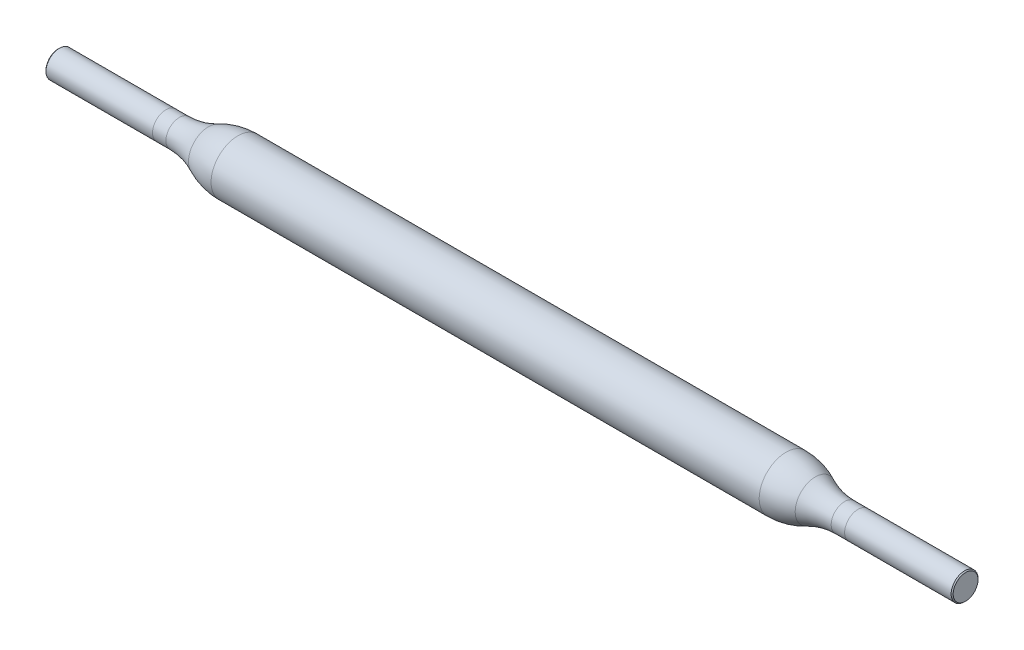
ISO-10303-21;
HEADER;
FILE_DESCRIPTION(('STEP AP214'),'2;1');
FILE_NAME('part.step','',(''),(''),'','','');
FILE_SCHEMA(('AUTOMOTIVE_DESIGN { 1 0 10303 214 1 1 1 1 }'));
ENDSEC;
DATA;
#1=APPLICATION_CONTEXT('core data for automotive mechanical design processes');
#2=APPLICATION_PROTOCOL_DEFINITION('international standard','automotive_design',2000,#1);
#3=PRODUCT_CONTEXT('',#1,'mechanical');
#4=PRODUCT('Part','Part','',(#3));
#5=PRODUCT_RELATED_PRODUCT_CATEGORY('part','',(#4));
#6=PRODUCT_DEFINITION_FORMATION('','',#4);
#7=PRODUCT_DEFINITION_CONTEXT('part definition',#1,'design');
#8=PRODUCT_DEFINITION('design','',#6,#7);
#9=PRODUCT_DEFINITION_SHAPE('','',#8);
#10=(LENGTH_UNIT() NAMED_UNIT(*) SI_UNIT(.MILLI.,.METRE.));
#11=(NAMED_UNIT(*) PLANE_ANGLE_UNIT() SI_UNIT($,.RADIAN.));
#12=(NAMED_UNIT(*) SI_UNIT($,.STERADIAN.) SOLID_ANGLE_UNIT());
#13=UNCERTAINTY_MEASURE_WITH_UNIT(LENGTH_MEASURE(1.E-05),#10,'distance_accuracy_value','');
#14=(GEOMETRIC_REPRESENTATION_CONTEXT(3) GLOBAL_UNCERTAINTY_ASSIGNED_CONTEXT((#13)) GLOBAL_UNIT_ASSIGNED_CONTEXT((#10,
#11,#12)) REPRESENTATION_CONTEXT('',''));
#15=CARTESIAN_POINT('',(0.,0.,0.));
#16=DIRECTION('',(0.,0.,1.));
#17=DIRECTION('',(1.,0.,0.));
#18=AXIS2_PLACEMENT_3D('',#15,#16,#17);
#19=CARTESIAN_POINT('',(-33.75,0.,0.));
#20=DIRECTION('',(-1.,0.,0.));
#21=DIRECTION('',(0.,0.,1.));
#22=AXIS2_PLACEMENT_3D('',#19,#20,#21);
#23=CYLINDRICAL_SURFACE('',#22,1.);
#24=CARTESIAN_POINT('',(24.75,0.,0.));
#25=DIRECTION('',(-1.,0.,0.));
#26=DIRECTION('',(0.,0.,1.));
#27=AXIS2_PLACEMENT_3D('',#24,#25,#26);
#28=CIRCLE('',#27,1.);
#29=CARTESIAN_POINT('',(24.75,0.,1.));
#30=VERTEX_POINT('',#29);
#31=EDGE_CURVE('E80',#30,#30,#28,.T.);
#32=ORIENTED_EDGE('',*,*,#31,.F.);
#33=EDGE_LOOP('',(#32));
#34=FACE_BOUND('',#33,.T.);
#35=CARTESIAN_POINT('',(25.75,0.,0.));
#36=DIRECTION('',(1.,0.,0.));
#37=DIRECTION('',(0.,0.,-1.));
#38=AXIS2_PLACEMENT_3D('',#35,#36,#37);
#39=CIRCLE('',#38,1.);
#40=CARTESIAN_POINT('',(25.75,0.,-1.));
#41=VERTEX_POINT('',#40);
#42=EDGE_CURVE('E72',#41,#41,#39,.T.);
#43=ORIENTED_EDGE('',*,*,#42,.F.);
#44=EDGE_LOOP('',(#43));
#45=FACE_BOUND('',#44,.T.);
#46=ADVANCED_FACE('F47',(#34,#45),#23,.T.);
#47=CARTESIAN_POINT('',(-33.75,0.,0.));
#48=DIRECTION('',(-1.,0.,0.));
#49=DIRECTION('',(0.,0.,1.));
#50=AXIS2_PLACEMENT_3D('',#47,#48,#49);
#51=CYLINDRICAL_SURFACE('',#50,1.);
#52=CARTESIAN_POINT('',(-33.675,0.,0.));
#53=DIRECTION('',(1.,0.,0.));
#54=DIRECTION('',(0.,0.,-1.));
#55=AXIS2_PLACEMENT_3D('',#52,#53,#54);
#56=CIRCLE('',#55,1.);
#57=CARTESIAN_POINT('',(-33.675,0.,-0.999999999999997));
#58=VERTEX_POINT('',#57);
#59=EDGE_CURVE('E10',#58,#58,#56,.T.);
#60=ORIENTED_EDGE('',*,*,#59,.T.);
#61=EDGE_LOOP('',(#60));
#62=FACE_BOUND('',#61,.T.);
#63=CARTESIAN_POINT('',(-25.75,0.,0.));
#64=DIRECTION('',(1.,0.,0.));
#65=DIRECTION('',(0.,0.,-1.));
#66=AXIS2_PLACEMENT_3D('',#63,#64,#65);
#67=CIRCLE('',#66,1.);
#68=CARTESIAN_POINT('',(-25.75,0.,-1.));
#69=VERTEX_POINT('',#68);
#70=EDGE_CURVE('E76',#69,#69,#67,.T.);
#71=ORIENTED_EDGE('',*,*,#70,.F.);
#72=EDGE_LOOP('',(#71));
#73=FACE_BOUND('',#72,.T.);
#74=ADVANCED_FACE('F140',(#62,#73),#51,.T.);
#75=CARTESIAN_POINT('',(-33.75,0.,0.));
#76=DIRECTION('',(1.,0.,0.));
#77=DIRECTION('',(0.,0.,-1.));
#78=AXIS2_PLACEMENT_3D('',#75,#76,#77);
#79=PLANE('',#78);
#80=CARTESIAN_POINT('',(-33.75,0.,0.));
#81=DIRECTION('',(1.,0.,0.));
#82=DIRECTION('',(0.,0.,-1.));
#83=AXIS2_PLACEMENT_3D('',#80,#81,#82);
#84=CIRCLE('',#83,0.925000000000023);
#85=CARTESIAN_POINT('',(-33.75,0.,-0.92500000000002));
#86=VERTEX_POINT('',#85);
#87=EDGE_CURVE('E56',#86,#86,#84,.F.);
#88=ORIENTED_EDGE('',*,*,#87,.T.);
#89=EDGE_LOOP('',(#88));
#90=FACE_BOUND('',#89,.T.);
#91=ADVANCED_FACE('F150',(#90),#79,.F.);
#92=CARTESIAN_POINT('',(33.75,0.,0.));
#93=DIRECTION('',(-1.,0.,0.));
#94=DIRECTION('',(0.,0.,1.));
#95=AXIS2_PLACEMENT_3D('',#92,#93,#94);
#96=PLANE('',#95);
#97=CARTESIAN_POINT('',(33.75,0.,0.));
#98=DIRECTION('',(-1.,0.,0.));
#99=DIRECTION('',(0.,0.,1.));
#100=AXIS2_PLACEMENT_3D('',#97,#98,#99);
#101=CIRCLE('',#100,0.925000000000009);
#102=CARTESIAN_POINT('',(33.75,0.,0.925000000000009));
#103=VERTEX_POINT('',#102);
#104=EDGE_CURVE('E61',#103,#103,#101,.F.);
#105=ORIENTED_EDGE('',*,*,#104,.T.);
#106=EDGE_LOOP('',(#105));
#107=FACE_BOUND('',#106,.T.);
#108=ADVANCED_FACE('F145',(#107),#96,.F.);
#109=CARTESIAN_POINT('',(33.675,0.,0.));
#110=DIRECTION('',(-1.,0.,0.));
#111=DIRECTION('',(0.,0.,1.));
#112=AXIS2_PLACEMENT_3D('',#109,#110,#111);
#113=CIRCLE('',#112,1.);
#114=CARTESIAN_POINT('',(33.675,0.,1.));
#115=VERTEX_POINT('',#114);
#116=EDGE_CURVE('E66',#115,#115,#113,.T.);
#117=ORIENTED_EDGE('',*,*,#116,.T.);
#118=EDGE_LOOP('',(#117));
#119=FACE_BOUND('',#118,.T.);
#120=ORIENTED_EDGE('',*,*,#42,.T.);
#121=EDGE_LOOP('',(#120));
#122=FACE_BOUND('',#121,.T.);
#123=ADVANCED_FACE('F134',(#119,#122),#23,.T.);
#124=CARTESIAN_POINT('',(24.75,0.,0.));
#125=DIRECTION('',(-1.,0.,0.));
#126=DIRECTION('',(0.,0.,1.));
#127=AXIS2_PLACEMENT_3D('',#124,#125,#126);
#128=TOROIDAL_SURFACE('',#127,6.,5.);
#129=CARTESIAN_POINT('',(22.5705505282297,0.,0.));
#130=DIRECTION('',(-1.,0.,0.));
#131=DIRECTION('',(0.,0.,1.));
#132=AXIS2_PLACEMENT_3D('',#129,#130,#131);
#133=CIRCLE('',#132,1.5);
#134=CARTESIAN_POINT('',(22.5705505282297,0.,1.5));
#135=VERTEX_POINT('',#134);
#136=EDGE_CURVE('E84',#135,#135,#133,.T.);
#137=ORIENTED_EDGE('',*,*,#136,.F.);
#138=EDGE_LOOP('',(#137));
#139=FACE_BOUND('',#138,.T.);
#140=ORIENTED_EDGE('',*,*,#31,.T.);
#141=EDGE_LOOP('',(#140));
#142=FACE_BOUND('',#141,.T.);
#143=ADVANCED_FACE('F128',(#139,#142),#128,.F.);
#144=CARTESIAN_POINT('',(20.3911010564593,0.,0.));
#145=DIRECTION('',(-1.,0.,0.));
#146=DIRECTION('',(0.,0.,1.));
#147=AXIS2_PLACEMENT_3D('',#144,#145,#146);
#148=DEGENERATE_TOROIDAL_SURFACE('',#147,3.,5.,.F.);
#149=CARTESIAN_POINT('',(20.3911010564593,0.,0.));
#150=DIRECTION('',(-1.,0.,0.));
#151=DIRECTION('',(0.,0.,1.));
#152=AXIS2_PLACEMENT_3D('',#149,#150,#151);
#153=CIRCLE('',#152,2.);
#154=CARTESIAN_POINT('',(20.3911010564593,0.,2.));
#155=VERTEX_POINT('',#154);
#156=EDGE_CURVE('E88',#155,#155,#153,.T.);
#157=ORIENTED_EDGE('',*,*,#156,.F.);
#158=EDGE_LOOP('',(#157));
#159=FACE_BOUND('',#158,.T.);
#160=ORIENTED_EDGE('',*,*,#136,.T.);
#161=EDGE_LOOP('',(#160));
#162=FACE_BOUND('',#161,.T.);
#163=ADVANCED_FACE('F122',(#159,#162),#148,.F.);
#164=CARTESIAN_POINT('',(-33.75,0.,0.));
#165=DIRECTION('',(-1.,0.,0.));
#166=DIRECTION('',(0.,0.,1.));
#167=AXIS2_PLACEMENT_3D('',#164,#165,#166);
#168=CYLINDRICAL_SURFACE('',#167,2.);
#169=CARTESIAN_POINT('',(-20.3911010564593,0.,0.));
#170=DIRECTION('',(-1.,0.,0.));
#171=DIRECTION('',(0.,0.,1.));
#172=AXIS2_PLACEMENT_3D('',#169,#170,#171);
#173=CIRCLE('',#172,2.);
#174=CARTESIAN_POINT('',(-20.3911010564593,0.,2.));
#175=VERTEX_POINT('',#174);
#176=EDGE_CURVE('E92',#175,#175,#173,.T.);
#177=ORIENTED_EDGE('',*,*,#176,.F.);
#178=EDGE_LOOP('',(#177));
#179=FACE_BOUND('',#178,.T.);
#180=ORIENTED_EDGE('',*,*,#156,.T.);
#181=EDGE_LOOP('',(#180));
#182=FACE_BOUND('',#181,.T.);
#183=ADVANCED_FACE('F116',(#179,#182),#168,.T.);
#184=CARTESIAN_POINT('',(-20.3911010564593,0.,0.));
#185=DIRECTION('',(-1.,0.,0.));
#186=DIRECTION('',(0.,0.,1.));
#187=AXIS2_PLACEMENT_3D('',#184,#185,#186);
#188=DEGENERATE_TOROIDAL_SURFACE('',#187,3.,5.,.F.);
#189=CARTESIAN_POINT('',(-22.5705505282297,0.,0.));
#190=DIRECTION('',(-1.,0.,0.));
#191=DIRECTION('',(0.,0.,1.));
#192=AXIS2_PLACEMENT_3D('',#189,#190,#191);
#193=CIRCLE('',#192,1.5);
#194=CARTESIAN_POINT('',(-22.5705505282297,0.,1.5));
#195=VERTEX_POINT('',#194);
#196=EDGE_CURVE('E96',#195,#195,#193,.T.);
#197=ORIENTED_EDGE('',*,*,#196,.F.);
#198=EDGE_LOOP('',(#197));
#199=FACE_BOUND('',#198,.T.);
#200=ORIENTED_EDGE('',*,*,#176,.T.);
#201=EDGE_LOOP('',(#200));
#202=FACE_BOUND('',#201,.T.);
#203=ADVANCED_FACE('F110',(#199,#202),#188,.F.);
#204=CARTESIAN_POINT('',(-24.75,0.,0.));
#205=DIRECTION('',(-1.,0.,0.));
#206=DIRECTION('',(0.,0.,1.));
#207=AXIS2_PLACEMENT_3D('',#204,#205,#206);
#208=TOROIDAL_SURFACE('',#207,6.,5.);
#209=CARTESIAN_POINT('',(-24.75,0.,0.));
#210=DIRECTION('',(-1.,0.,0.));
#211=DIRECTION('',(0.,0.,1.));
#212=AXIS2_PLACEMENT_3D('',#209,#210,#211);
#213=CIRCLE('',#212,1.);
#214=CARTESIAN_POINT('',(-24.75,0.,1.));
#215=VERTEX_POINT('',#214);
#216=EDGE_CURVE('E100',#215,#215,#213,.T.);
#217=ORIENTED_EDGE('',*,*,#216,.F.);
#218=EDGE_LOOP('',(#217));
#219=FACE_BOUND('',#218,.T.);
#220=ORIENTED_EDGE('',*,*,#196,.T.);
#221=EDGE_LOOP('',(#220));
#222=FACE_BOUND('',#221,.T.);
#223=ADVANCED_FACE('F107',(#219,#222),#208,.F.);
#224=ORIENTED_EDGE('',*,*,#70,.T.);
#225=EDGE_LOOP('',(#224));
#226=FACE_BOUND('',#225,.T.);
#227=ORIENTED_EDGE('',*,*,#216,.T.);
#228=EDGE_LOOP('',(#227));
#229=FACE_BOUND('',#228,.T.);
#230=ADVANCED_FACE('F105',(#226,#229),#51,.T.);
#231=CARTESIAN_POINT('',(33.675,0.,0.));
#232=DIRECTION('',(-1.,0.,0.));
#233=DIRECTION('',(0.,0.,1.));
#234=AXIS2_PLACEMENT_3D('',#231,#232,#233);
#235=CONICAL_SURFACE('',#234,1.,0.785398163397445);
#236=ORIENTED_EDGE('',*,*,#104,.F.);
#237=EDGE_LOOP('',(#236));
#238=FACE_BOUND('',#237,.T.);
#239=ORIENTED_EDGE('',*,*,#116,.F.);
#240=EDGE_LOOP('',(#239));
#241=FACE_BOUND('',#240,.T.);
#242=ADVANCED_FACE('F156',(#238,#241),#235,.T.);
#243=CARTESIAN_POINT('',(-33.75,0.,0.));
#244=DIRECTION('',(1.,0.,0.));
#245=DIRECTION('',(0.,0.,-1.));
#246=AXIS2_PLACEMENT_3D('',#243,#244,#245);
#247=CONICAL_SURFACE('',#246,0.925000000000023,0.785398163397495);
#248=CARTESIAN_POINT('',(-33.675,0.,-0.999999999999997));
#249=CARTESIAN_POINT('',(-33.67578125,0.,-0.999218749999997));
#250=CARTESIAN_POINT('',(-33.6765625,0.,-0.998437499999998));
#251=CARTESIAN_POINT('',(-33.678125,0.,-0.996874999999999));
#252=CARTESIAN_POINT('',(-33.67890625,0.,-0.996093749999999));
#253=CARTESIAN_POINT('',(-33.68046875,0.,-0.994531249999999));
#254=CARTESIAN_POINT('',(-33.68125,0.,-0.993749999999999));
#255=CARTESIAN_POINT('',(-33.6828125,0.,-0.992187499999999));
#256=CARTESIAN_POINT('',(-33.68359375,0.,-0.99140625));
#257=CARTESIAN_POINT('',(-33.68515625,0.,-0.989843750000001));
#258=CARTESIAN_POINT('',(-33.6859375,0.,-0.989062500000001));
#259=CARTESIAN_POINT('',(-33.6875,0.,-0.987500000000001));
#260=CARTESIAN_POINT('',(-33.68828125,0.,-0.986718750000001));
#261=CARTESIAN_POINT('',(-33.68984375,0.,-0.985156250000001));
#262=CARTESIAN_POINT('',(-33.690625,0.,-0.984375000000002));
#263=CARTESIAN_POINT('',(-33.6921875,0.,-0.982812500000003));
#264=CARTESIAN_POINT('',(-33.69296875,0.,-0.982031250000003));
#265=CARTESIAN_POINT('',(-33.69453125,0.,-0.980468750000003));
#266=CARTESIAN_POINT('',(-33.6953125,0.,-0.979687500000003));
#267=CARTESIAN_POINT('',(-33.696875,0.,-0.978125000000003));
#268=CARTESIAN_POINT('',(-33.69765625,0.,-0.977343750000004));
#269=CARTESIAN_POINT('',(-33.69921875,0.,-0.975781250000005));
#270=CARTESIAN_POINT('',(-33.7,0.,-0.975000000000006));
#271=CARTESIAN_POINT('',(-33.7015625,0.,-0.973437500000006));
#272=CARTESIAN_POINT('',(-33.70234375,0.,-0.972656250000005));
#273=CARTESIAN_POINT('',(-33.70390625,0.,-0.971093750000005));
#274=CARTESIAN_POINT('',(-33.7046875,0.,-0.970312500000006));
#275=CARTESIAN_POINT('',(-33.70625,0.,-0.968750000000007));
#276=CARTESIAN_POINT('',(-33.70703125,0.,-0.967968750000008));
#277=CARTESIAN_POINT('',(-33.70859375,0.,-0.966406250000008));
#278=CARTESIAN_POINT('',(-33.709375,0.,-0.965625000000007));
#279=CARTESIAN_POINT('',(-33.7109375,0.,-0.964062500000007));
#280=CARTESIAN_POINT('',(-33.71171875,0.,-0.963281250000008));
#281=CARTESIAN_POINT('',(-33.71328125,0.,-0.961718750000009));
#282=CARTESIAN_POINT('',(-33.7140625,0.,-0.96093750000001));
#283=CARTESIAN_POINT('',(-33.715625,0.,-0.95937500000001));
#284=CARTESIAN_POINT('',(-33.71640625,0.,-0.958593750000009));
#285=CARTESIAN_POINT('',(-33.71796875,0.,-0.957031250000009));
#286=CARTESIAN_POINT('',(-33.71875,0.,-0.95625000000001));
#287=CARTESIAN_POINT('',(-33.7203125,0.,-0.954687500000011));
#288=CARTESIAN_POINT('',(-33.72109375,0.,-0.953906250000012));
#289=CARTESIAN_POINT('',(-33.72265625,0.,-0.952343750000012));
#290=CARTESIAN_POINT('',(-33.7234375,0.,-0.951562500000011));
#291=CARTESIAN_POINT('',(-33.725,0.,-0.950000000000011));
#292=CARTESIAN_POINT('',(-33.72578125,0.,-0.949218750000012));
#293=CARTESIAN_POINT('',(-33.72734375,0.,-0.947656250000013));
#294=CARTESIAN_POINT('',(-33.728125,0.,-0.946875000000014));
#295=CARTESIAN_POINT('',(-33.7296875,0.,-0.945312500000014));
#296=CARTESIAN_POINT('',(-33.73046875,0.,-0.944531250000013));
#297=CARTESIAN_POINT('',(-33.73203125,0.,-0.942968750000013));
#298=CARTESIAN_POINT('',(-33.7328125,0.,-0.942187500000014));
#299=CARTESIAN_POINT('',(-33.734375,0.,-0.940625000000015));
#300=CARTESIAN_POINT('',(-33.73515625,0.,-0.939843750000016));
#301=CARTESIAN_POINT('',(-33.73671875,0.,-0.938281250000016));
#302=CARTESIAN_POINT('',(-33.7375,0.,-0.937500000000015));
#303=CARTESIAN_POINT('',(-33.7390625,0.,-0.935937500000016));
#304=CARTESIAN_POINT('',(-33.73984375,0.,-0.935156250000016));
#305=CARTESIAN_POINT('',(-33.74140625,0.,-0.933593750000017));
#306=CARTESIAN_POINT('',(-33.7421875,0.,-0.932812500000018));
#307=CARTESIAN_POINT('',(-33.74375,0.,-0.931250000000018));
#308=CARTESIAN_POINT('',(-33.74453125,0.,-0.930468750000017));
#309=CARTESIAN_POINT('',(-33.74609375,0.,-0.928906250000018));
#310=CARTESIAN_POINT('',(-33.746875,0.,-0.928125000000019));
#311=CARTESIAN_POINT('',(-33.7484375,0.,-0.92656250000002));
#312=CARTESIAN_POINT('',(-33.74921875,0.,-0.925781250000021));
#313=CARTESIAN_POINT('',(-33.75,0.,-0.92500000000002));
#314=B_SPLINE_CURVE_WITH_KNOTS('',3,(#248,#249,#250,#251,#252,#253,#254,#255,#256,#257,#258,
#259,#260,#261,#262,#263,#264,#265,#266,#267,#268,#269,#270,#271,#272,#273,#274,#275,#276,#277,
#278,#279,#280,#281,#282,#283,#284,#285,#286,#287,#288,#289,#290,#291,#292,#293,#294,#295,#296,
#297,#298,#299,#300,#301,#302,#303,#304,#305,#306,#307,#308,#309,#310,#311,#312,#313),
.UNSPECIFIED.,.F.,.F.,(4,2,2,2,2,2,2,2,2,2,2,2,2,2,2,2,2,2,2,2,2,2,2,2,2,2,2,2,2,2,2,2,4),(0.,
0.0033145630368125,0.00662912607362499,0.00994368911043258,0.0132582521472451,
0.0165728151840576,0.0198873782208652,0.0232019412576777,0.0265165042944902,0.0298310673312977,
0.0331456303681102,0.0364601934049227,0.0397747564417303,0.0430893194785428,0.0464038825153553,
0.0497184455521629,0.0530330085889754,0.0563475716257879,0.0596621346625955,0.062976697699408,
0.0662912607362205,0.0696058237730281,0.0729203868098406,0.0762349498466531,0.0795495128834607,
0.0828640759202732,0.0861786389570857,0.0894932019938933,0.0928077650307058,0.0961223280675183,
0.0994368911043259,0.102751454141138,0.106066017177946),.UNSPECIFIED.);
#315=EDGE_CURVE('BSEAM50',#58,#86,#314,.T.);
#316=ORIENTED_EDGE('',*,*,#59,.F.);
#317=ORIENTED_EDGE('',*,*,#87,.F.);
#318=ORIENTED_EDGE('',*,*,#315,.T.);
#319=ORIENTED_EDGE('',*,*,#315,.F.);
#320=EDGE_LOOP('',(#316,#318,#317,#319));
#321=FACE_BOUND('',#320,.T.);
#322=ADVANCED_FACE('F50',(#321),#247,.T.);
#323=CLOSED_SHELL('',(#46,#74,#91,#108,#123,#143,#163,#183,#203,#223,#230,#242,#322));
#324=MANIFOLD_SOLID_BREP('B2',#323);
#325=ADVANCED_BREP_SHAPE_REPRESENTATION('',(#18,#324),#14);
#326=SHAPE_DEFINITION_REPRESENTATION(#9,#325);
ENDSEC;
END-ISO-10303-21;
